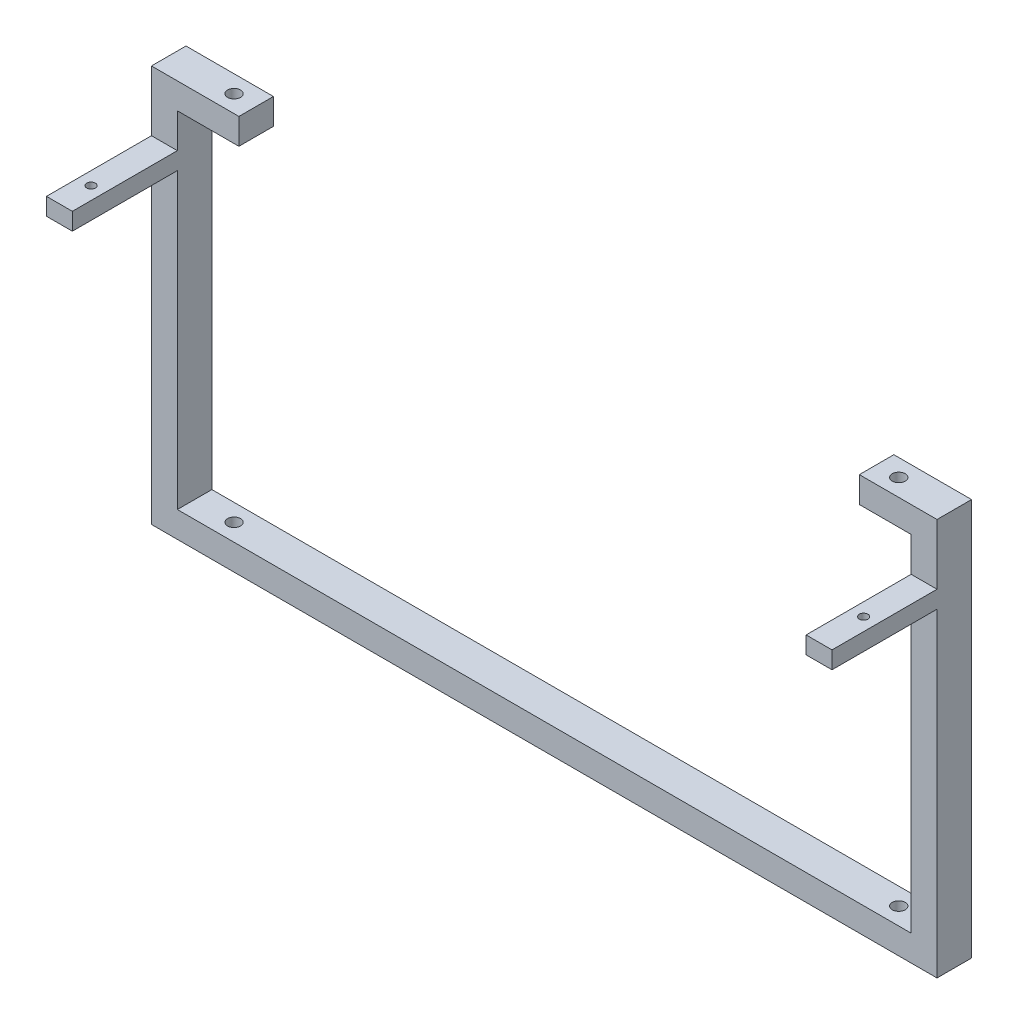
ISO-10303-21;
HEADER;
FILE_DESCRIPTION(('STEP AP214'),'2;1');
FILE_NAME('part.step','',(''),(''),'','','');
FILE_SCHEMA(('AUTOMOTIVE_DESIGN { 1 0 10303 214 1 1 1 1 }'));
ENDSEC;
DATA;
#1=APPLICATION_CONTEXT('core data for automotive mechanical design processes');
#2=APPLICATION_PROTOCOL_DEFINITION('international standard','automotive_design',2000,#1);
#3=PRODUCT_CONTEXT('',#1,'mechanical');
#4=PRODUCT('Part','Part','',(#3));
#5=PRODUCT_RELATED_PRODUCT_CATEGORY('part','',(#4));
#6=PRODUCT_DEFINITION_FORMATION('','',#4);
#7=PRODUCT_DEFINITION_CONTEXT('part definition',#1,'design');
#8=PRODUCT_DEFINITION('design','',#6,#7);
#9=PRODUCT_DEFINITION_SHAPE('','',#8);
#10=(LENGTH_UNIT() NAMED_UNIT(*) SI_UNIT(.MILLI.,.METRE.));
#11=(NAMED_UNIT(*) PLANE_ANGLE_UNIT() SI_UNIT($,.RADIAN.));
#12=(NAMED_UNIT(*) SI_UNIT($,.STERADIAN.) SOLID_ANGLE_UNIT());
#13=UNCERTAINTY_MEASURE_WITH_UNIT(LENGTH_MEASURE(1.E-05),#10,'distance_accuracy_value','');
#14=(GEOMETRIC_REPRESENTATION_CONTEXT(3) GLOBAL_UNCERTAINTY_ASSIGNED_CONTEXT((#13)) GLOBAL_UNIT_ASSIGNED_CONTEXT((#10,
#11,#12)) REPRESENTATION_CONTEXT('',''));
#15=CARTESIAN_POINT('',(0.,0.,0.));
#16=DIRECTION('',(0.,0.,1.));
#17=DIRECTION('',(1.,0.,0.));
#18=AXIS2_PLACEMENT_3D('',#15,#16,#17);
#19=CARTESIAN_POINT('',(0.,0.,80.));
#20=DIRECTION('',(0.,0.,-1.));
#21=DIRECTION('',(-1.,0.,0.));
#22=AXIS2_PLACEMENT_3D('',#19,#20,#21);
#23=PLANE('',#22);
#24=DIRECTION('',(-1.,0.,0.));
#25=VECTOR('',#24,1.);
#26=CARTESIAN_POINT('',(0.,-80.,80.));
#27=LINE('',#26,#25);
#28=CARTESIAN_POINT('',(1624.28187878994,-80.0000000000001,80.));
#29=VERTEX_POINT('',#28);
#30=CARTESIAN_POINT('',(1564.28187878994,-80.,80.));
#31=VERTEX_POINT('',#30);
#32=EDGE_CURVE('E47',#29,#31,#27,.T.);
#33=ORIENTED_EDGE('',*,*,#32,.F.);
#34=DIRECTION('',(0.,1.,0.));
#35=VECTOR('',#34,1.);
#36=CARTESIAN_POINT('',(1624.28187878994,-860.,80.));
#37=LINE('',#36,#35);
#38=CARTESIAN_POINT('',(1624.28187878994,60.,80.));
#39=VERTEX_POINT('',#38);
#40=EDGE_CURVE('E264',#29,#39,#37,.T.);
#41=ORIENTED_EDGE('',*,*,#40,.T.);
#42=DIRECTION('',(-1.,0.,0.));
#43=VECTOR('',#42,1.);
#44=CARTESIAN_POINT('',(1624.28187878994,60.,80.));
#45=LINE('',#44,#43);
#46=CARTESIAN_POINT('',(1444.2768144157,60.,80.));
#47=VERTEX_POINT('',#46);
#48=EDGE_CURVE('E266',#39,#47,#45,.T.);
#49=ORIENTED_EDGE('',*,*,#48,.T.);
#50=DIRECTION('',(0.,-1.,0.));
#51=VECTOR('',#50,1.);
#52=CARTESIAN_POINT('',(1444.2768144157,60.,80.));
#53=LINE('',#52,#51);
#54=CARTESIAN_POINT('',(1444.2768144157,0.,80.));
#55=VERTEX_POINT('',#54);
#56=EDGE_CURVE('E268',#47,#55,#53,.T.);
#57=ORIENTED_EDGE('',*,*,#56,.T.);
#58=DIRECTION('',(1.,0.,0.));
#59=VECTOR('',#58,1.);
#60=CARTESIAN_POINT('',(1444.2768144157,0.,80.));
#61=LINE('',#60,#59);
#62=CARTESIAN_POINT('',(1564.28187878994,0.,80.));
#63=VERTEX_POINT('',#62);
#64=EDGE_CURVE('E270',#55,#63,#61,.T.);
#65=ORIENTED_EDGE('',*,*,#64,.T.);
#66=DIRECTION('',(0.,-1.,0.));
#67=VECTOR('',#66,1.);
#68=CARTESIAN_POINT('',(1564.28187878994,0.,80.));
#69=LINE('',#68,#67);
#70=EDGE_CURVE('E273',#63,#31,#69,.T.);
#71=ORIENTED_EDGE('',*,*,#70,.T.);
#72=EDGE_LOOP('',(#33,#41,#49,#57,#65,#71));
#73=FACE_BOUND('',#72,.T.);
#74=ADVANCED_FACE('F32',(#73),#23,.F.);
#75=CARTESIAN_POINT('',(1624.28187878994,-860.,80.));
#76=VERTEX_POINT('',#75);
#77=CARTESIAN_POINT('',(1624.28187878994,-120.,80.));
#78=VERTEX_POINT('',#77);
#79=EDGE_CURVE('E55',#76,#78,#37,.T.);
#80=ORIENTED_EDGE('',*,*,#79,.T.);
#81=DIRECTION('',(-1.,0.,0.));
#82=VECTOR('',#81,1.);
#83=CARTESIAN_POINT('',(0.,-120.,80.));
#84=LINE('',#83,#82);
#85=CARTESIAN_POINT('',(1564.28187878994,-120.,80.));
#86=VERTEX_POINT('',#85);
#87=EDGE_CURVE('E187',#78,#86,#84,.T.);
#88=ORIENTED_EDGE('',*,*,#87,.T.);
#89=CARTESIAN_POINT('',(1564.28187878994,-800.,80.));
#90=VERTEX_POINT('',#89);
#91=EDGE_CURVE('E272',#86,#90,#69,.T.);
#92=ORIENTED_EDGE('',*,*,#91,.T.);
#93=DIRECTION('',(-1.,0.,0.));
#94=VECTOR('',#93,1.);
#95=CARTESIAN_POINT('',(-135.718121210061,-800.,80.));
#96=LINE('',#95,#94);
#97=CARTESIAN_POINT('',(-135.718121210061,-800.,80.));
#98=VERTEX_POINT('',#97);
#99=EDGE_CURVE('E275',#90,#98,#96,.T.);
#100=ORIENTED_EDGE('',*,*,#99,.T.);
#101=DIRECTION('',(0.,1.,0.));
#102=VECTOR('',#101,1.);
#103=CARTESIAN_POINT('',(-135.718121210061,0.,80.));
#104=LINE('',#103,#102);
#105=CARTESIAN_POINT('',(-135.718121210061,-120.,80.));
#106=VERTEX_POINT('',#105);
#107=EDGE_CURVE('E278',#98,#106,#104,.T.);
#108=ORIENTED_EDGE('',*,*,#107,.T.);
#109=DIRECTION('',(1.,0.,0.));
#110=VECTOR('',#109,1.);
#111=CARTESIAN_POINT('',(0.,-120.,80.));
#112=LINE('',#111,#110);
#113=CARTESIAN_POINT('',(-195.718121210061,-120.,80.));
#114=VERTEX_POINT('',#113);
#115=EDGE_CURVE('E40',#114,#106,#112,.T.);
#116=ORIENTED_EDGE('',*,*,#115,.F.);
#117=DIRECTION('',(0.,-1.,0.));
#118=VECTOR('',#117,1.);
#119=CARTESIAN_POINT('',(-195.718121210061,60.,80.));
#120=LINE('',#119,#118);
#121=CARTESIAN_POINT('',(-195.718121210061,-860.,80.));
#122=VERTEX_POINT('',#121);
#123=EDGE_CURVE('E259',#114,#122,#120,.T.);
#124=ORIENTED_EDGE('',*,*,#123,.T.);
#125=DIRECTION('',(1.,0.,0.));
#126=VECTOR('',#125,1.);
#127=CARTESIAN_POINT('',(-195.718121210061,-860.,80.));
#128=LINE('',#127,#126);
#129=EDGE_CURVE('E262',#122,#76,#128,.T.);
#130=ORIENTED_EDGE('',*,*,#129,.T.);
#131=EDGE_LOOP('',(#80,#88,#92,#100,#108,#116,#124,#130));
#132=FACE_BOUND('',#131,.T.);
#133=ADVANCED_FACE('F366',(#132),#23,.F.);
#134=CARTESIAN_POINT('',(6.86246403116561,60.,80.));
#135=DIRECTION('',(-1.,0.,0.));
#136=DIRECTION('',(0.,0.,1.));
#137=AXIS2_PLACEMENT_3D('',#134,#135,#136);
#138=PLANE('',#137);
#139=DIRECTION('',(0.,1.,0.));
#140=VECTOR('',#139,1.);
#141=CARTESIAN_POINT('',(6.86246403116561,60.,0.));
#142=LINE('',#141,#140);
#143=CARTESIAN_POINT('',(6.86246403116561,0.,0.));
#144=VERTEX_POINT('',#143);
#145=CARTESIAN_POINT('',(6.86246403116561,60.,0.));
#146=VERTEX_POINT('',#145);
#147=EDGE_CURVE('E252',#144,#146,#142,.T.);
#148=ORIENTED_EDGE('',*,*,#147,.T.);
#149=DIRECTION('',(0.,0.,-1.));
#150=VECTOR('',#149,1.);
#151=CARTESIAN_POINT('',(6.86246403116561,60.,80.));
#152=LINE('',#151,#150);
#153=CARTESIAN_POINT('',(6.86246403116561,60.,80.));
#154=VERTEX_POINT('',#153);
#155=EDGE_CURVE('E338',#154,#146,#152,.T.);
#156=ORIENTED_EDGE('',*,*,#155,.F.);
#157=DIRECTION('',(0.,1.,0.));
#158=VECTOR('',#157,1.);
#159=CARTESIAN_POINT('',(6.86246403116561,60.,80.));
#160=LINE('',#159,#158);
#161=CARTESIAN_POINT('',(6.86246403116561,0.,80.));
#162=VERTEX_POINT('',#161);
#163=EDGE_CURVE('E253',#162,#154,#160,.T.);
#164=ORIENTED_EDGE('',*,*,#163,.F.);
#165=DIRECTION('',(0.,0.,-1.));
#166=VECTOR('',#165,1.);
#167=CARTESIAN_POINT('',(6.86246403116561,0.,80.));
#168=LINE('',#167,#166);
#169=EDGE_CURVE('E282',#162,#144,#168,.T.);
#170=ORIENTED_EDGE('',*,*,#169,.T.);
#171=EDGE_LOOP('',(#148,#156,#164,#170));
#172=FACE_BOUND('',#171,.T.);
#173=ADVANCED_FACE('F34',(#172),#138,.F.);
#174=CARTESIAN_POINT('',(6.86246403116561,60.,80.));
#175=DIRECTION('',(0.,-1.,0.));
#176=DIRECTION('',(1.,0.,0.));
#177=AXIS2_PLACEMENT_3D('',#174,#175,#176);
#178=PLANE('',#177);
#179=CARTESIAN_POINT('',(-44.3949416405232,60.,39.9999999999967));
#180=DIRECTION('',(0.,1.,0.));
#181=DIRECTION('',(-1.,0.,0.));
#182=AXIS2_PLACEMENT_3D('',#179,#180,#181);
#183=CIRCLE('',#182,15.);
#184=CARTESIAN_POINT('',(-59.3949416405232,60.,39.9999999999967));
#185=VERTEX_POINT('',#184);
#186=EDGE_CURVE('E242',#185,#185,#183,.T.);
#187=ORIENTED_EDGE('',*,*,#186,.F.);
#188=EDGE_LOOP('',(#187));
#189=FACE_BOUND('',#188,.T.);
#190=DIRECTION('',(-1.,0.,0.));
#191=VECTOR('',#190,1.);
#192=CARTESIAN_POINT('',(6.86246403116561,60.,0.));
#193=LINE('',#192,#191);
#194=CARTESIAN_POINT('',(-195.718121210061,60.,0.));
#195=VERTEX_POINT('',#194);
#196=EDGE_CURVE('E285',#146,#195,#193,.T.);
#197=ORIENTED_EDGE('',*,*,#196,.T.);
#198=DIRECTION('',(0.,0.,-1.));
#199=VECTOR('',#198,1.);
#200=CARTESIAN_POINT('',(-195.718121210061,60.,80.));
#201=LINE('',#200,#199);
#202=CARTESIAN_POINT('',(-195.718121210061,60.,80.));
#203=VERTEX_POINT('',#202);
#204=EDGE_CURVE('E335',#203,#195,#201,.T.);
#205=ORIENTED_EDGE('',*,*,#204,.F.);
#206=DIRECTION('',(-1.,0.,0.));
#207=VECTOR('',#206,1.);
#208=CARTESIAN_POINT('',(6.86246403116561,60.,80.));
#209=LINE('',#208,#207);
#210=EDGE_CURVE('E256',#154,#203,#209,.T.);
#211=ORIENTED_EDGE('',*,*,#210,.F.);
#212=ORIENTED_EDGE('',*,*,#155,.T.);
#213=EDGE_LOOP('',(#197,#205,#211,#212));
#214=FACE_BOUND('',#213,.T.);
#215=ADVANCED_FACE('F461',(#189,#214),#178,.F.);
#216=CARTESIAN_POINT('',(-195.718121210061,60.,80.));
#217=DIRECTION('',(1.,0.,0.));
#218=DIRECTION('',(0.,1.,0.));
#219=AXIS2_PLACEMENT_3D('',#216,#217,#218);
#220=PLANE('',#219);
#221=DIRECTION('',(0.,0.,1.));
#222=VECTOR('',#221,1.);
#223=CARTESIAN_POINT('',(-195.718121210061,-80.,40.));
#224=LINE('',#223,#222);
#225=CARTESIAN_POINT('',(-195.718121210061,-80.,80.));
#226=VERTEX_POINT('',#225);
#227=CARTESIAN_POINT('',(-195.718121210061,-80.,323.290811992464));
#228=VERTEX_POINT('',#227);
#229=EDGE_CURVE('E213',#226,#228,#224,.T.);
#230=ORIENTED_EDGE('',*,*,#229,.F.);
#231=EDGE_CURVE('E260',#203,#226,#120,.T.);
#232=ORIENTED_EDGE('',*,*,#231,.F.);
#233=ORIENTED_EDGE('',*,*,#204,.T.);
#234=DIRECTION('',(0.,-1.,0.));
#235=VECTOR('',#234,1.);
#236=CARTESIAN_POINT('',(-195.718121210061,60.,0.));
#237=LINE('',#236,#235);
#238=CARTESIAN_POINT('',(-195.718121210061,-860.,0.));
#239=VERTEX_POINT('',#238);
#240=EDGE_CURVE('E287',#195,#239,#237,.T.);
#241=ORIENTED_EDGE('',*,*,#240,.T.);
#242=DIRECTION('',(0.,0.,-1.));
#243=VECTOR('',#242,1.);
#244=CARTESIAN_POINT('',(-195.718121210061,-860.,80.));
#245=LINE('',#244,#243);
#246=EDGE_CURVE('E332',#122,#239,#245,.T.);
#247=ORIENTED_EDGE('',*,*,#246,.F.);
#248=ORIENTED_EDGE('',*,*,#123,.F.);
#249=DIRECTION('',(0.,0.,1.));
#250=VECTOR('',#249,1.);
#251=CARTESIAN_POINT('',(-195.718121210061,-120.,40.));
#252=LINE('',#251,#250);
#253=CARTESIAN_POINT('',(-195.718121210061,-120.,323.290811992464));
#254=VERTEX_POINT('',#253);
#255=EDGE_CURVE('E210',#114,#254,#252,.T.);
#256=ORIENTED_EDGE('',*,*,#255,.T.);
#257=DIRECTION('',(0.,-1.,0.));
#258=VECTOR('',#257,1.);
#259=CARTESIAN_POINT('',(-195.718121210061,-80.,323.290811992464));
#260=LINE('',#259,#258);
#261=EDGE_CURVE('E229',#228,#254,#260,.T.);
#262=ORIENTED_EDGE('',*,*,#261,.F.);
#263=EDGE_LOOP('',(#230,#232,#233,#241,#247,#248,#256,#262));
#264=FACE_BOUND('',#263,.T.);
#265=ADVANCED_FACE('F362',(#264),#220,.F.);
#266=CARTESIAN_POINT('',(-195.718121210061,-860.,80.));
#267=DIRECTION('',(0.,1.,0.));
#268=DIRECTION('',(0.,0.,1.));
#269=AXIS2_PLACEMENT_3D('',#266,#267,#268);
#270=PLANE('',#269);
#271=CARTESIAN_POINT('',(1495.60505835948,-860.,39.9999999999967));
#272=DIRECTION('',(0.,1.,0.));
#273=DIRECTION('',(-1.,0.,0.));
#274=AXIS2_PLACEMENT_3D('',#271,#272,#273);
#275=CIRCLE('',#274,14.9999999999999);
#276=CARTESIAN_POINT('',(1480.60505835948,-860.,39.9999999999967));
#277=VERTEX_POINT('',#276);
#278=EDGE_CURVE('E233',#277,#277,#275,.T.);
#279=ORIENTED_EDGE('',*,*,#278,.T.);
#280=EDGE_LOOP('',(#279));
#281=FACE_BOUND('',#280,.T.);
#282=CARTESIAN_POINT('',(-44.3949416405231,-860.,39.9999999999967));
#283=DIRECTION('',(0.,1.,0.));
#284=DIRECTION('',(-1.,0.,0.));
#285=AXIS2_PLACEMENT_3D('',#282,#283,#284);
#286=CIRCLE('',#285,15.);
#287=CARTESIAN_POINT('',(-59.3949416405231,-860.,39.9999999999967));
#288=VERTEX_POINT('',#287);
#289=EDGE_CURVE('E243',#288,#288,#286,.T.);
#290=ORIENTED_EDGE('',*,*,#289,.T.);
#291=EDGE_LOOP('',(#290));
#292=FACE_BOUND('',#291,.T.);
#293=DIRECTION('',(1.,0.,0.));
#294=VECTOR('',#293,1.);
#295=CARTESIAN_POINT('',(-195.718121210061,-860.,0.));
#296=LINE('',#295,#294);
#297=CARTESIAN_POINT('',(1624.28187878994,-860.,0.));
#298=VERTEX_POINT('',#297);
#299=EDGE_CURVE('E289',#239,#298,#296,.T.);
#300=ORIENTED_EDGE('',*,*,#299,.T.);
#301=DIRECTION('',(0.,0.,-1.));
#302=VECTOR('',#301,1.);
#303=CARTESIAN_POINT('',(1624.28187878994,-860.,80.));
#304=LINE('',#303,#302);
#305=EDGE_CURVE('E329',#76,#298,#304,.T.);
#306=ORIENTED_EDGE('',*,*,#305,.F.);
#307=ORIENTED_EDGE('',*,*,#129,.F.);
#308=ORIENTED_EDGE('',*,*,#246,.T.);
#309=EDGE_LOOP('',(#300,#306,#307,#308));
#310=FACE_BOUND('',#309,.T.);
#311=ADVANCED_FACE('F369',(#281,#292,#310),#270,.F.);
#312=CARTESIAN_POINT('',(1624.28187878994,-860.,80.));
#313=DIRECTION('',(-1.,0.,0.));
#314=DIRECTION('',(0.,0.,1.));
#315=AXIS2_PLACEMENT_3D('',#312,#313,#314);
#316=PLANE('',#315);
#317=ORIENTED_EDGE('',*,*,#40,.F.);
#318=DIRECTION('',(0.,0.,-1.));
#319=VECTOR('',#318,1.);
#320=CARTESIAN_POINT('',(1624.28187878994,-80.,40.));
#321=LINE('',#320,#319);
#322=CARTESIAN_POINT('',(1624.28187878994,-80.,323.290811992464));
#323=VERTEX_POINT('',#322);
#324=EDGE_CURVE('E178',#323,#29,#321,.T.);
#325=ORIENTED_EDGE('',*,*,#324,.F.);
#326=DIRECTION('',(0.,-1.,0.));
#327=VECTOR('',#326,1.);
#328=CARTESIAN_POINT('',(1624.28187878994,-80.,323.290811992464));
#329=LINE('',#328,#327);
#330=CARTESIAN_POINT('',(1624.28187878994,-120.,323.290811992464));
#331=VERTEX_POINT('',#330);
#332=EDGE_CURVE('E188',#323,#331,#329,.T.);
#333=ORIENTED_EDGE('',*,*,#332,.T.);
#334=DIRECTION('',(0.,0.,-1.));
#335=VECTOR('',#334,1.);
#336=CARTESIAN_POINT('',(1624.28187878994,-120.,40.));
#337=LINE('',#336,#335);
#338=EDGE_CURVE('E197',#331,#78,#337,.T.);
#339=ORIENTED_EDGE('',*,*,#338,.T.);
#340=ORIENTED_EDGE('',*,*,#79,.F.);
#341=ORIENTED_EDGE('',*,*,#305,.T.);
#342=DIRECTION('',(0.,1.,0.));
#343=VECTOR('',#342,1.);
#344=CARTESIAN_POINT('',(1624.28187878994,-860.,0.));
#345=LINE('',#344,#343);
#346=CARTESIAN_POINT('',(1624.28187878994,60.,0.));
#347=VERTEX_POINT('',#346);
#348=EDGE_CURVE('E291',#298,#347,#345,.T.);
#349=ORIENTED_EDGE('',*,*,#348,.T.);
#350=DIRECTION('',(0.,0.,-1.));
#351=VECTOR('',#350,1.);
#352=CARTESIAN_POINT('',(1624.28187878994,60.,80.));
#353=LINE('',#352,#351);
#354=EDGE_CURVE('E326',#39,#347,#353,.T.);
#355=ORIENTED_EDGE('',*,*,#354,.F.);
#356=EDGE_LOOP('',(#317,#325,#333,#339,#340,#341,#349,#355));
#357=FACE_BOUND('',#356,.T.);
#358=ADVANCED_FACE('F373',(#357),#316,.F.);
#359=CARTESIAN_POINT('',(1624.28187878994,60.,80.));
#360=DIRECTION('',(0.,-1.,0.));
#361=DIRECTION('',(1.,0.,0.));
#362=AXIS2_PLACEMENT_3D('',#359,#360,#361);
#363=PLANE('',#362);
#364=CARTESIAN_POINT('',(1495.60505835948,60.0000000000002,39.9999999999967));
#365=DIRECTION('',(0.,1.,0.));
#366=DIRECTION('',(-1.,0.,0.));
#367=AXIS2_PLACEMENT_3D('',#364,#365,#366);
#368=CIRCLE('',#367,14.9999999999999);
#369=CARTESIAN_POINT('',(1480.60505835948,60.0000000000002,39.9999999999967));
#370=VERTEX_POINT('',#369);
#371=EDGE_CURVE('E232',#370,#370,#368,.T.);
#372=ORIENTED_EDGE('',*,*,#371,.F.);
#373=EDGE_LOOP('',(#372));
#374=FACE_BOUND('',#373,.T.);
#375=DIRECTION('',(-1.,0.,0.));
#376=VECTOR('',#375,1.);
#377=CARTESIAN_POINT('',(1624.28187878994,60.,0.));
#378=LINE('',#377,#376);
#379=CARTESIAN_POINT('',(1444.2768144157,60.,0.));
#380=VERTEX_POINT('',#379);
#381=EDGE_CURVE('E293',#347,#380,#378,.T.);
#382=ORIENTED_EDGE('',*,*,#381,.T.);
#383=DIRECTION('',(0.,0.,-1.));
#384=VECTOR('',#383,1.);
#385=CARTESIAN_POINT('',(1444.2768144157,60.,80.));
#386=LINE('',#385,#384);
#387=EDGE_CURVE('E323',#47,#380,#386,.T.);
#388=ORIENTED_EDGE('',*,*,#387,.F.);
#389=ORIENTED_EDGE('',*,*,#48,.F.);
#390=ORIENTED_EDGE('',*,*,#354,.T.);
#391=EDGE_LOOP('',(#382,#388,#389,#390));
#392=FACE_BOUND('',#391,.T.);
#393=ADVANCED_FACE('F450',(#374,#392),#363,.F.);
#394=CARTESIAN_POINT('',(1444.2768144157,60.,80.));
#395=DIRECTION('',(1.,0.,0.));
#396=DIRECTION('',(0.,0.,-1.));
#397=AXIS2_PLACEMENT_3D('',#394,#395,#396);
#398=PLANE('',#397);
#399=DIRECTION('',(0.,-1.,0.));
#400=VECTOR('',#399,1.);
#401=CARTESIAN_POINT('',(1444.2768144157,60.,0.));
#402=LINE('',#401,#400);
#403=CARTESIAN_POINT('',(1444.2768144157,0.,0.));
#404=VERTEX_POINT('',#403);
#405=EDGE_CURVE('E295',#380,#404,#402,.T.);
#406=ORIENTED_EDGE('',*,*,#405,.T.);
#407=DIRECTION('',(0.,0.,-1.));
#408=VECTOR('',#407,1.);
#409=CARTESIAN_POINT('',(1444.2768144157,0.,80.));
#410=LINE('',#409,#408);
#411=EDGE_CURVE('E320',#55,#404,#410,.T.);
#412=ORIENTED_EDGE('',*,*,#411,.F.);
#413=ORIENTED_EDGE('',*,*,#56,.F.);
#414=ORIENTED_EDGE('',*,*,#387,.T.);
#415=EDGE_LOOP('',(#406,#412,#413,#414));
#416=FACE_BOUND('',#415,.T.);
#417=ADVANCED_FACE('F446',(#416),#398,.F.);
#418=CARTESIAN_POINT('',(1444.2768144157,0.,80.));
#419=DIRECTION('',(0.,1.,0.));
#420=DIRECTION('',(0.,0.,1.));
#421=AXIS2_PLACEMENT_3D('',#418,#419,#420);
#422=PLANE('',#421);
#423=CARTESIAN_POINT('',(1495.60505835948,0.,39.9999999999967));
#424=DIRECTION('',(0.,1.,0.));
#425=DIRECTION('',(0.,0.,1.));
#426=AXIS2_PLACEMENT_3D('',#423,#424,#425);
#427=CIRCLE('',#426,14.9999999999999);
#428=CARTESIAN_POINT('',(1495.60505835948,0.,54.9999999999966));
#429=VERTEX_POINT('',#428);
#430=EDGE_CURVE('E239',#429,#429,#427,.T.);
#431=ORIENTED_EDGE('',*,*,#430,.T.);
#432=EDGE_LOOP('',(#431));
#433=FACE_BOUND('',#432,.T.);
#434=DIRECTION('',(1.,0.,0.));
#435=VECTOR('',#434,1.);
#436=CARTESIAN_POINT('',(1444.2768144157,0.,0.));
#437=LINE('',#436,#435);
#438=CARTESIAN_POINT('',(1564.28187878994,0.,0.));
#439=VERTEX_POINT('',#438);
#440=EDGE_CURVE('E297',#404,#439,#437,.T.);
#441=ORIENTED_EDGE('',*,*,#440,.T.);
#442=DIRECTION('',(0.,0.,-1.));
#443=VECTOR('',#442,1.);
#444=CARTESIAN_POINT('',(1564.28187878994,0.,80.));
#445=LINE('',#444,#443);
#446=EDGE_CURVE('E317',#63,#439,#445,.T.);
#447=ORIENTED_EDGE('',*,*,#446,.F.);
#448=ORIENTED_EDGE('',*,*,#64,.F.);
#449=ORIENTED_EDGE('',*,*,#411,.T.);
#450=EDGE_LOOP('',(#441,#447,#448,#449));
#451=FACE_BOUND('',#450,.T.);
#452=ADVANCED_FACE('F443',(#433,#451),#422,.F.);
#453=CARTESIAN_POINT('',(1564.28187878994,0.,80.));
#454=DIRECTION('',(1.,0.,0.));
#455=DIRECTION('',(0.,0.,-1.));
#456=AXIS2_PLACEMENT_3D('',#453,#454,#455);
#457=PLANE('',#456);
#458=ORIENTED_EDGE('',*,*,#91,.F.);
#459=DIRECTION('',(0.,0.,1.));
#460=VECTOR('',#459,1.);
#461=CARTESIAN_POINT('',(1564.28187878994,-120.,40.));
#462=LINE('',#461,#460);
#463=CARTESIAN_POINT('',(1564.28187878994,-120.,323.290811992464));
#464=VERTEX_POINT('',#463);
#465=EDGE_CURVE('E184',#86,#464,#462,.T.);
#466=ORIENTED_EDGE('',*,*,#465,.T.);
#467=DIRECTION('',(0.,-1.,0.));
#468=VECTOR('',#467,1.);
#469=CARTESIAN_POINT('',(1564.28187878994,-80.,323.290811992464));
#470=LINE('',#469,#468);
#471=CARTESIAN_POINT('',(1564.28187878994,-80.,323.290811992464));
#472=VERTEX_POINT('',#471);
#473=EDGE_CURVE('E181',#472,#464,#470,.T.);
#474=ORIENTED_EDGE('',*,*,#473,.F.);
#475=DIRECTION('',(0.,0.,1.));
#476=VECTOR('',#475,1.);
#477=CARTESIAN_POINT('',(1564.28187878994,-80.,40.));
#478=LINE('',#477,#476);
#479=EDGE_CURVE('E169',#31,#472,#478,.T.);
#480=ORIENTED_EDGE('',*,*,#479,.F.);
#481=ORIENTED_EDGE('',*,*,#70,.F.);
#482=ORIENTED_EDGE('',*,*,#446,.T.);
#483=DIRECTION('',(0.,-1.,0.));
#484=VECTOR('',#483,1.);
#485=CARTESIAN_POINT('',(1564.28187878994,0.,0.));
#486=LINE('',#485,#484);
#487=CARTESIAN_POINT('',(1564.28187878994,-800.,0.));
#488=VERTEX_POINT('',#487);
#489=EDGE_CURVE('E299',#439,#488,#486,.T.);
#490=ORIENTED_EDGE('',*,*,#489,.T.);
#491=DIRECTION('',(0.,0.,-1.));
#492=VECTOR('',#491,1.);
#493=CARTESIAN_POINT('',(1564.28187878994,-800.,80.));
#494=LINE('',#493,#492);
#495=EDGE_CURVE('E314',#90,#488,#494,.T.);
#496=ORIENTED_EDGE('',*,*,#495,.F.);
#497=EDGE_LOOP('',(#458,#466,#474,#480,#481,#482,#490,#496));
#498=FACE_BOUND('',#497,.T.);
#499=ADVANCED_FACE('F182',(#498),#457,.F.);
#500=CARTESIAN_POINT('',(-135.718121210061,-800.,80.));
#501=DIRECTION('',(0.,-1.,0.));
#502=DIRECTION('',(0.,0.,-1.));
#503=AXIS2_PLACEMENT_3D('',#500,#501,#502);
#504=PLANE('',#503);
#505=CARTESIAN_POINT('',(1495.60505835948,-800.,39.9999999999967));
#506=DIRECTION('',(0.,-1.,0.));
#507=DIRECTION('',(0.,0.,-1.));
#508=AXIS2_PLACEMENT_3D('',#505,#506,#507);
#509=CIRCLE('',#508,14.9999999999999);
#510=CARTESIAN_POINT('',(1495.60505835948,-800.,24.9999999999968));
#511=VERTEX_POINT('',#510);
#512=EDGE_CURVE('E236',#511,#511,#509,.T.);
#513=ORIENTED_EDGE('',*,*,#512,.T.);
#514=EDGE_LOOP('',(#513));
#515=FACE_BOUND('',#514,.T.);
#516=CARTESIAN_POINT('',(-44.3949416405231,-800.,39.9999999999967));
#517=DIRECTION('',(0.,-1.,0.));
#518=DIRECTION('',(0.,0.,-1.));
#519=AXIS2_PLACEMENT_3D('',#516,#517,#518);
#520=CIRCLE('',#519,15.);
#521=CARTESIAN_POINT('',(-44.3949416405231,-800.,24.9999999999967));
#522=VERTEX_POINT('',#521);
#523=EDGE_CURVE('E249',#522,#522,#520,.T.);
#524=ORIENTED_EDGE('',*,*,#523,.T.);
#525=EDGE_LOOP('',(#524));
#526=FACE_BOUND('',#525,.T.);
#527=DIRECTION('',(-1.,0.,0.));
#528=VECTOR('',#527,1.);
#529=CARTESIAN_POINT('',(-135.718121210061,-800.,0.));
#530=LINE('',#529,#528);
#531=CARTESIAN_POINT('',(-135.718121210061,-800.,0.));
#532=VERTEX_POINT('',#531);
#533=EDGE_CURVE('E301',#488,#532,#530,.T.);
#534=ORIENTED_EDGE('',*,*,#533,.T.);
#535=DIRECTION('',(0.,0.,-1.));
#536=VECTOR('',#535,1.);
#537=CARTESIAN_POINT('',(-135.718121210061,-800.,80.));
#538=LINE('',#537,#536);
#539=EDGE_CURVE('E311',#98,#532,#538,.T.);
#540=ORIENTED_EDGE('',*,*,#539,.F.);
#541=ORIENTED_EDGE('',*,*,#99,.F.);
#542=ORIENTED_EDGE('',*,*,#495,.T.);
#543=EDGE_LOOP('',(#534,#540,#541,#542));
#544=FACE_BOUND('',#543,.T.);
#545=ADVANCED_FACE('F383',(#515,#526,#544),#504,.F.);
#546=CARTESIAN_POINT('',(-135.718121210061,0.,80.));
#547=DIRECTION('',(-1.,0.,0.));
#548=DIRECTION('',(0.,-1.,0.));
#549=AXIS2_PLACEMENT_3D('',#546,#547,#548);
#550=PLANE('',#549);
#551=CARTESIAN_POINT('',(-135.718121210061,-80.,80.));
#552=VERTEX_POINT('',#551);
#553=CARTESIAN_POINT('',(-135.718121210061,0.,80.));
#554=VERTEX_POINT('',#553);
#555=EDGE_CURVE('E277',#552,#554,#104,.T.);
#556=ORIENTED_EDGE('',*,*,#555,.F.);
#557=DIRECTION('',(0.,0.,-1.));
#558=VECTOR('',#557,1.);
#559=CARTESIAN_POINT('',(-135.718121210061,-80.,40.));
#560=LINE('',#559,#558);
#561=CARTESIAN_POINT('',(-135.718121210061,-80.,323.290811992464));
#562=VERTEX_POINT('',#561);
#563=EDGE_CURVE('E218',#562,#552,#560,.T.);
#564=ORIENTED_EDGE('',*,*,#563,.F.);
#565=DIRECTION('',(0.,-1.,0.));
#566=VECTOR('',#565,1.);
#567=CARTESIAN_POINT('',(-135.718121210061,-80.,323.290811992464));
#568=LINE('',#567,#566);
#569=CARTESIAN_POINT('',(-135.718121210061,-120.,323.290811992464));
#570=VERTEX_POINT('',#569);
#571=EDGE_CURVE('E221',#562,#570,#568,.T.);
#572=ORIENTED_EDGE('',*,*,#571,.T.);
#573=DIRECTION('',(0.,0.,-1.));
#574=VECTOR('',#573,1.);
#575=CARTESIAN_POINT('',(-135.718121210061,-120.,40.));
#576=LINE('',#575,#574);
#577=EDGE_CURVE('E216',#570,#106,#576,.T.);
#578=ORIENTED_EDGE('',*,*,#577,.T.);
#579=ORIENTED_EDGE('',*,*,#107,.F.);
#580=ORIENTED_EDGE('',*,*,#539,.T.);
#581=DIRECTION('',(0.,1.,0.));
#582=VECTOR('',#581,1.);
#583=CARTESIAN_POINT('',(-135.718121210061,0.,0.));
#584=LINE('',#583,#582);
#585=CARTESIAN_POINT('',(-135.718121210061,0.,0.));
#586=VERTEX_POINT('',#585);
#587=EDGE_CURVE('E303',#532,#586,#584,.T.);
#588=ORIENTED_EDGE('',*,*,#587,.T.);
#589=DIRECTION('',(0.,0.,-1.));
#590=VECTOR('',#589,1.);
#591=CARTESIAN_POINT('',(-135.718121210061,0.,80.));
#592=LINE('',#591,#590);
#593=EDGE_CURVE('E308',#554,#586,#592,.T.);
#594=ORIENTED_EDGE('',*,*,#593,.F.);
#595=EDGE_LOOP('',(#556,#564,#572,#578,#579,#580,#588,#594));
#596=FACE_BOUND('',#595,.T.);
#597=ADVANCED_FACE('F353',(#596),#550,.F.);
#598=CARTESIAN_POINT('',(6.86246403116561,0.,80.));
#599=DIRECTION('',(0.,1.,0.));
#600=DIRECTION('',(-1.,0.,0.));
#601=AXIS2_PLACEMENT_3D('',#598,#599,#600);
#602=PLANE('',#601);
#603=CARTESIAN_POINT('',(-44.3949416405232,0.,39.9999999999967));
#604=DIRECTION('',(0.,1.,0.));
#605=DIRECTION('',(-1.,0.,0.));
#606=AXIS2_PLACEMENT_3D('',#603,#604,#605);
#607=CIRCLE('',#606,15.);
#608=CARTESIAN_POINT('',(-59.3949416405232,0.,39.9999999999967));
#609=VERTEX_POINT('',#608);
#610=EDGE_CURVE('E246',#609,#609,#607,.T.);
#611=ORIENTED_EDGE('',*,*,#610,.T.);
#612=EDGE_LOOP('',(#611));
#613=FACE_BOUND('',#612,.T.);
#614=DIRECTION('',(1.,0.,0.));
#615=VECTOR('',#614,1.);
#616=CARTESIAN_POINT('',(6.86246403116561,0.,0.));
#617=LINE('',#616,#615);
#618=EDGE_CURVE('E257',#586,#144,#617,.T.);
#619=ORIENTED_EDGE('',*,*,#618,.T.);
#620=ORIENTED_EDGE('',*,*,#169,.F.);
#621=DIRECTION('',(1.,0.,0.));
#622=VECTOR('',#621,1.);
#623=CARTESIAN_POINT('',(6.86246403116561,0.,80.));
#624=LINE('',#623,#622);
#625=EDGE_CURVE('E280',#554,#162,#624,.T.);
#626=ORIENTED_EDGE('',*,*,#625,.F.);
#627=ORIENTED_EDGE('',*,*,#593,.T.);
#628=EDGE_LOOP('',(#619,#620,#626,#627));
#629=FACE_BOUND('',#628,.T.);
#630=ADVANCED_FACE('F392',(#613,#629),#602,.F.);
#631=ORIENTED_EDGE('',*,*,#231,.T.);
#632=DIRECTION('',(1.,0.,0.));
#633=VECTOR('',#632,1.);
#634=CARTESIAN_POINT('',(0.,-80.,80.));
#635=LINE('',#634,#633);
#636=EDGE_CURVE('E11',#226,#552,#635,.T.);
#637=ORIENTED_EDGE('',*,*,#636,.T.);
#638=ORIENTED_EDGE('',*,*,#555,.T.);
#639=ORIENTED_EDGE('',*,*,#625,.T.);
#640=ORIENTED_EDGE('',*,*,#163,.T.);
#641=ORIENTED_EDGE('',*,*,#210,.T.);
#642=EDGE_LOOP('',(#631,#637,#638,#639,#640,#641));
#643=FACE_BOUND('',#642,.T.);
#644=ADVANCED_FACE('F398',(#643),#23,.F.);
#645=CARTESIAN_POINT('',(0.,0.,0.));
#646=DIRECTION('',(0.,0.,-1.));
#647=DIRECTION('',(-1.,0.,0.));
#648=AXIS2_PLACEMENT_3D('',#645,#646,#647);
#649=PLANE('',#648);
#650=ORIENTED_EDGE('',*,*,#147,.F.);
#651=ORIENTED_EDGE('',*,*,#618,.F.);
#652=ORIENTED_EDGE('',*,*,#587,.F.);
#653=ORIENTED_EDGE('',*,*,#533,.F.);
#654=ORIENTED_EDGE('',*,*,#489,.F.);
#655=ORIENTED_EDGE('',*,*,#440,.F.);
#656=ORIENTED_EDGE('',*,*,#405,.F.);
#657=ORIENTED_EDGE('',*,*,#381,.F.);
#658=ORIENTED_EDGE('',*,*,#348,.F.);
#659=ORIENTED_EDGE('',*,*,#299,.F.);
#660=ORIENTED_EDGE('',*,*,#240,.F.);
#661=ORIENTED_EDGE('',*,*,#196,.F.);
#662=EDGE_LOOP('',(#650,#651,#652,#653,#654,#655,#656,#657,#658,#659,#660,#661));
#663=FACE_BOUND('',#662,.T.);
#664=ADVANCED_FACE('F389',(#663),#649,.T.);
#665=CARTESIAN_POINT('',(-44.3949416405231,-860.,39.9999999999967));
#666=DIRECTION('',(0.,1.,0.));
#667=DIRECTION('',(-1.,0.,0.));
#668=AXIS2_PLACEMENT_3D('',#665,#666,#667);
#669=CYLINDRICAL_SURFACE('',#668,15.);
#670=ORIENTED_EDGE('',*,*,#186,.T.);
#671=EDGE_LOOP('',(#670));
#672=FACE_BOUND('',#671,.T.);
#673=ORIENTED_EDGE('',*,*,#610,.F.);
#674=EDGE_LOOP('',(#673));
#675=FACE_BOUND('',#674,.T.);
#676=ADVANCED_FACE('F430',(#672,#675),#669,.F.);
#677=ORIENTED_EDGE('',*,*,#289,.F.);
#678=EDGE_LOOP('',(#677));
#679=FACE_BOUND('',#678,.T.);
#680=ORIENTED_EDGE('',*,*,#523,.F.);
#681=EDGE_LOOP('',(#680));
#682=FACE_BOUND('',#681,.T.);
#683=ADVANCED_FACE('F603',(#679,#682),#669,.F.);
#684=CARTESIAN_POINT('',(1495.60505835948,-860.,39.9999999999967));
#685=DIRECTION('',(0.,1.,0.));
#686=DIRECTION('',(-1.,0.,0.));
#687=AXIS2_PLACEMENT_3D('',#684,#685,#686);
#688=CYLINDRICAL_SURFACE('',#687,14.9999999999999);
#689=ORIENTED_EDGE('',*,*,#278,.F.);
#690=EDGE_LOOP('',(#689));
#691=FACE_BOUND('',#690,.T.);
#692=ORIENTED_EDGE('',*,*,#512,.F.);
#693=EDGE_LOOP('',(#692));
#694=FACE_BOUND('',#693,.T.);
#695=ADVANCED_FACE('F413',(#691,#694),#688,.F.);
#696=ORIENTED_EDGE('',*,*,#371,.T.);
#697=EDGE_LOOP('',(#696));
#698=FACE_BOUND('',#697,.T.);
#699=ORIENTED_EDGE('',*,*,#430,.F.);
#700=EDGE_LOOP('',(#699));
#701=FACE_BOUND('',#700,.T.);
#702=ADVANCED_FACE('F404',(#698,#701),#688,.F.);
#703=CARTESIAN_POINT('',(0.,-80.,0.));
#704=DIRECTION('',(0.,1.,0.));
#705=DIRECTION('',(0.,0.,1.));
#706=AXIS2_PLACEMENT_3D('',#703,#704,#705);
#707=PLANE('',#706);
#708=CARTESIAN_POINT('',(-165.718121210061,-80.,249.999999999997));
#709=DIRECTION('',(0.,1.,0.));
#710=DIRECTION('',(0.,0.,1.));
#711=AXIS2_PLACEMENT_3D('',#708,#709,#710);
#712=CIRCLE('',#711,10.);
#713=CARTESIAN_POINT('',(-165.718121210061,-80.,259.999999999997));
#714=VERTEX_POINT('',#713);
#715=EDGE_CURVE('E207',#714,#714,#712,.T.);
#716=ORIENTED_EDGE('',*,*,#715,.F.);
#717=EDGE_LOOP('',(#716));
#718=FACE_BOUND('',#717,.T.);
#719=ORIENTED_EDGE('',*,*,#636,.F.);
#720=ORIENTED_EDGE('',*,*,#229,.T.);
#721=DIRECTION('',(1.,0.,0.));
#722=VECTOR('',#721,1.);
#723=CARTESIAN_POINT('',(-195.718121210061,-80.,323.290811992464));
#724=LINE('',#723,#722);
#725=EDGE_CURVE('E215',#228,#562,#724,.T.);
#726=ORIENTED_EDGE('',*,*,#725,.T.);
#727=ORIENTED_EDGE('',*,*,#563,.T.);
#728=EDGE_LOOP('',(#719,#720,#726,#727));
#729=FACE_BOUND('',#728,.T.);
#730=ADVANCED_FACE('F402',(#718,#729),#707,.T.);
#731=CARTESIAN_POINT('',(0.,-120.,0.));
#732=DIRECTION('',(0.,1.,0.));
#733=DIRECTION('',(0.,0.,1.));
#734=AXIS2_PLACEMENT_3D('',#731,#732,#733);
#735=PLANE('',#734);
#736=CARTESIAN_POINT('',(-165.718121210061,-120.,249.999999999997));
#737=DIRECTION('',(0.,1.,0.));
#738=DIRECTION('',(0.,0.,1.));
#739=AXIS2_PLACEMENT_3D('',#736,#737,#738);
#740=CIRCLE('',#739,10.);
#741=CARTESIAN_POINT('',(-165.718121210061,-120.,259.999999999997));
#742=VERTEX_POINT('',#741);
#743=EDGE_CURVE('E206',#742,#742,#740,.T.);
#744=ORIENTED_EDGE('',*,*,#743,.T.);
#745=EDGE_LOOP('',(#744));
#746=FACE_BOUND('',#745,.T.);
#747=ORIENTED_EDGE('',*,*,#255,.F.);
#748=ORIENTED_EDGE('',*,*,#115,.T.);
#749=ORIENTED_EDGE('',*,*,#577,.F.);
#750=DIRECTION('',(1.,0.,0.));
#751=VECTOR('',#750,1.);
#752=CARTESIAN_POINT('',(-195.718121210061,-120.,323.290811992464));
#753=LINE('',#752,#751);
#754=EDGE_CURVE('E223',#254,#570,#753,.T.);
#755=ORIENTED_EDGE('',*,*,#754,.F.);
#756=EDGE_LOOP('',(#747,#748,#749,#755));
#757=FACE_BOUND('',#756,.T.);
#758=ADVANCED_FACE('F348',(#746,#757),#735,.F.);
#759=CARTESIAN_POINT('',(-195.718121210061,-80.,323.290811992464));
#760=DIRECTION('',(0.,0.,-1.));
#761=DIRECTION('',(-1.,0.,0.));
#762=AXIS2_PLACEMENT_3D('',#759,#760,#761);
#763=PLANE('',#762);
#764=ORIENTED_EDGE('',*,*,#754,.T.);
#765=ORIENTED_EDGE('',*,*,#571,.F.);
#766=ORIENTED_EDGE('',*,*,#725,.F.);
#767=ORIENTED_EDGE('',*,*,#261,.T.);
#768=EDGE_LOOP('',(#764,#765,#766,#767));
#769=FACE_BOUND('',#768,.T.);
#770=ADVANCED_FACE('F358',(#769),#763,.F.);
#771=CARTESIAN_POINT('',(-165.718121210061,-80.,249.999999999997));
#772=DIRECTION('',(0.,-1.,0.));
#773=DIRECTION('',(0.,0.,-1.));
#774=AXIS2_PLACEMENT_3D('',#771,#772,#773);
#775=CYLINDRICAL_SURFACE('',#774,10.);
#776=ORIENTED_EDGE('',*,*,#715,.T.);
#777=EDGE_LOOP('',(#776));
#778=FACE_BOUND('',#777,.T.);
#779=ORIENTED_EDGE('',*,*,#743,.F.);
#780=EDGE_LOOP('',(#779));
#781=FACE_BOUND('',#780,.T.);
#782=ADVANCED_FACE('F489',(#778,#781),#775,.F.);
#783=CARTESIAN_POINT('',(0.,-80.,0.));
#784=DIRECTION('',(0.,-1.,0.));
#785=DIRECTION('',(0.,0.,-1.));
#786=AXIS2_PLACEMENT_3D('',#783,#784,#785);
#787=PLANE('',#786);
#788=CARTESIAN_POINT('',(1594.28187878994,-80.,219.999999999997));
#789=DIRECTION('',(0.,1.,0.));
#790=DIRECTION('',(0.,0.,1.));
#791=AXIS2_PLACEMENT_3D('',#788,#789,#790);
#792=CIRCLE('',#791,10.0000000000001);
#793=CARTESIAN_POINT('',(1594.28187878994,-80.,229.999999999997));
#794=VERTEX_POINT('',#793);
#795=EDGE_CURVE('E200',#794,#794,#792,.T.);
#796=ORIENTED_EDGE('',*,*,#795,.F.);
#797=EDGE_LOOP('',(#796));
#798=FACE_BOUND('',#797,.T.);
#799=ORIENTED_EDGE('',*,*,#324,.T.);
#800=ORIENTED_EDGE('',*,*,#32,.T.);
#801=ORIENTED_EDGE('',*,*,#479,.T.);
#802=DIRECTION('',(1.,0.,0.));
#803=VECTOR('',#802,1.);
#804=CARTESIAN_POINT('',(1624.28187878994,-80.,323.290811992464));
#805=LINE('',#804,#803);
#806=EDGE_CURVE('E174',#472,#323,#805,.T.);
#807=ORIENTED_EDGE('',*,*,#806,.T.);
#808=EDGE_LOOP('',(#799,#800,#801,#807));
#809=FACE_BOUND('',#808,.T.);
#810=ADVANCED_FACE('F172',(#798,#809),#787,.F.);
#811=CARTESIAN_POINT('',(0.,-120.,0.));
#812=DIRECTION('',(0.,-1.,0.));
#813=DIRECTION('',(0.,0.,-1.));
#814=AXIS2_PLACEMENT_3D('',#811,#812,#813);
#815=PLANE('',#814);
#816=CARTESIAN_POINT('',(1594.28187878994,-120.,219.999999999997));
#817=DIRECTION('',(0.,1.,0.));
#818=DIRECTION('',(0.,0.,1.));
#819=AXIS2_PLACEMENT_3D('',#816,#817,#818);
#820=CIRCLE('',#819,10.0000000000001);
#821=CARTESIAN_POINT('',(1594.28187878994,-120.,229.999999999997));
#822=VERTEX_POINT('',#821);
#823=EDGE_CURVE('E479',#822,#822,#820,.T.);
#824=ORIENTED_EDGE('',*,*,#823,.T.);
#825=EDGE_LOOP('',(#824));
#826=FACE_BOUND('',#825,.T.);
#827=ORIENTED_EDGE('',*,*,#87,.F.);
#828=ORIENTED_EDGE('',*,*,#338,.F.);
#829=DIRECTION('',(1.,0.,0.));
#830=VECTOR('',#829,1.);
#831=CARTESIAN_POINT('',(1624.28187878994,-120.,323.290811992464));
#832=LINE('',#831,#830);
#833=EDGE_CURVE('E202',#464,#331,#832,.T.);
#834=ORIENTED_EDGE('',*,*,#833,.F.);
#835=ORIENTED_EDGE('',*,*,#465,.F.);
#836=EDGE_LOOP('',(#827,#828,#834,#835));
#837=FACE_BOUND('',#836,.T.);
#838=ADVANCED_FACE('F376',(#826,#837),#815,.T.);
#839=CARTESIAN_POINT('',(1624.28187878994,-80.,323.290811992464));
#840=DIRECTION('',(0.,0.,-1.));
#841=DIRECTION('',(-1.,0.,0.));
#842=AXIS2_PLACEMENT_3D('',#839,#840,#841);
#843=PLANE('',#842);
#844=ORIENTED_EDGE('',*,*,#833,.T.);
#845=ORIENTED_EDGE('',*,*,#332,.F.);
#846=ORIENTED_EDGE('',*,*,#806,.F.);
#847=ORIENTED_EDGE('',*,*,#473,.T.);
#848=EDGE_LOOP('',(#844,#845,#846,#847));
#849=FACE_BOUND('',#848,.T.);
#850=ADVANCED_FACE('F190',(#849),#843,.F.);
#851=CARTESIAN_POINT('',(1594.28187878994,-80.,219.999999999997));
#852=DIRECTION('',(0.,-1.,0.));
#853=DIRECTION('',(0.,0.,-1.));
#854=AXIS2_PLACEMENT_3D('',#851,#852,#853);
#855=CYLINDRICAL_SURFACE('',#854,10.0000000000001);
#856=ORIENTED_EDGE('',*,*,#795,.T.);
#857=EDGE_LOOP('',(#856));
#858=FACE_BOUND('',#857,.T.);
#859=ORIENTED_EDGE('',*,*,#823,.F.);
#860=EDGE_LOOP('',(#859));
#861=FACE_BOUND('',#860,.T.);
#862=ADVANCED_FACE('F485',(#858,#861),#855,.F.);
#863=CLOSED_SHELL('',(#74,#133,#173,#215,#265,#311,#358,#393,#417,#452,#499,#545,#597,#630,#644,
#664,#676,#683,#695,#702,#730,#758,#770,#782,#810,#838,#850,#862));
#864=MANIFOLD_SOLID_BREP('B2',#863);
#865=ADVANCED_BREP_SHAPE_REPRESENTATION('',(#18,#864),#14);
#866=SHAPE_DEFINITION_REPRESENTATION(#9,#865);
ENDSEC;
END-ISO-10303-21;
